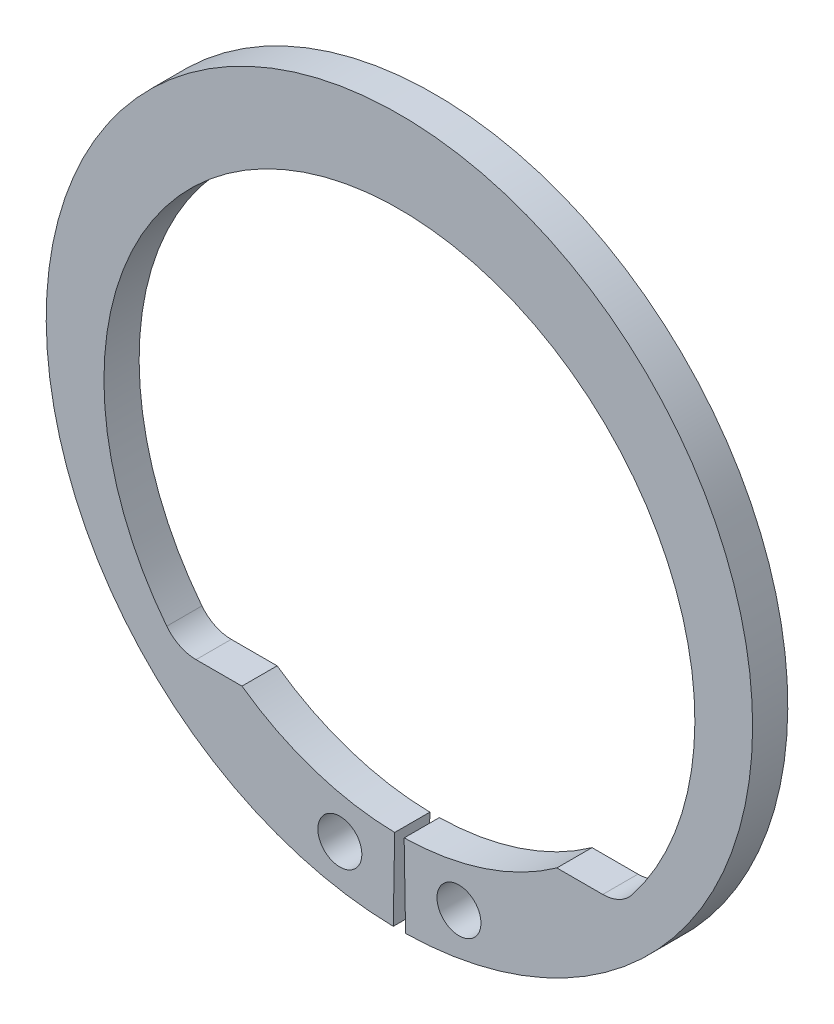
ISO-10303-21;
HEADER;
FILE_DESCRIPTION(('STEP AP214'),'2;1');
FILE_NAME('part.step','',(''),(''),'','','');
FILE_SCHEMA(('AUTOMOTIVE_DESIGN { 1 0 10303 214 1 1 1 1 }'));
ENDSEC;
DATA;
#1=APPLICATION_CONTEXT('core data for automotive mechanical design processes');
#2=APPLICATION_PROTOCOL_DEFINITION('international standard','automotive_design',2000,#1);
#3=PRODUCT_CONTEXT('',#1,'mechanical');
#4=PRODUCT('Part','Part','',(#3));
#5=PRODUCT_RELATED_PRODUCT_CATEGORY('part','',(#4));
#6=PRODUCT_DEFINITION_FORMATION('','',#4);
#7=PRODUCT_DEFINITION_CONTEXT('part definition',#1,'design');
#8=PRODUCT_DEFINITION('design','',#6,#7);
#9=PRODUCT_DEFINITION_SHAPE('','',#8);
#10=(LENGTH_UNIT() NAMED_UNIT(*) SI_UNIT(.MILLI.,.METRE.));
#11=(NAMED_UNIT(*) PLANE_ANGLE_UNIT() SI_UNIT($,.RADIAN.));
#12=(NAMED_UNIT(*) SI_UNIT($,.STERADIAN.) SOLID_ANGLE_UNIT());
#13=UNCERTAINTY_MEASURE_WITH_UNIT(LENGTH_MEASURE(1.E-05),#10,'distance_accuracy_value','');
#14=(GEOMETRIC_REPRESENTATION_CONTEXT(3) GLOBAL_UNCERTAINTY_ASSIGNED_CONTEXT((#13)) GLOBAL_UNIT_ASSIGNED_CONTEXT((#10,
#11,#12)) REPRESENTATION_CONTEXT('',''));
#15=CARTESIAN_POINT('',(0.,0.,0.));
#16=DIRECTION('',(0.,0.,1.));
#17=DIRECTION('',(1.,0.,0.));
#18=AXIS2_PLACEMENT_3D('',#15,#16,#17);
#19=CARTESIAN_POINT('',(0.,0.,0.6));
#20=DIRECTION('',(0.,0.,1.));
#21=DIRECTION('',(1.,0.,0.));
#22=AXIS2_PLACEMENT_3D('',#19,#20,#21);
#23=PLANE('',#22);
#24=CARTESIAN_POINT('',(0.,0.,0.6));
#25=DIRECTION('',(0.,0.,-1.));
#26=DIRECTION('',(1.,0.,0.));
#27=AXIS2_PLACEMENT_3D('',#24,#25,#26);
#28=CIRCLE('',#27,9.25);
#29=CARTESIAN_POINT('',(-0.161434759544872,-9.24859118019662,0.6));
#30=VERTEX_POINT('',#29);
#31=CARTESIAN_POINT('',(-5.37133596044777,-7.53068721963677,0.6));
#32=VERTEX_POINT('',#31);
#33=EDGE_CURVE('E170',#30,#32,#28,.T.);
#34=ORIENTED_EDGE('',*,*,#33,.T.);
#35=DIRECTION('',(-1.,0.,0.));
#36=VECTOR('',#35,1.);
#37=CARTESIAN_POINT('',(-5.37133596044777,-7.53068721963677,0.6));
#38=LINE('',#37,#36);
#39=CARTESIAN_POINT('',(-6.93737566496488,-7.53068721963677,0.6));
#40=VERTEX_POINT('',#39);
#41=EDGE_CURVE('E172',#32,#40,#38,.T.);
#42=ORIENTED_EDGE('',*,*,#41,.T.);
#43=CARTESIAN_POINT('',(-6.93737566496488,-6.26068721963677,0.6));
#44=DIRECTION('',(0.,0.,1.));
#45=DIRECTION('',(1.,0.,0.));
#46=AXIS2_PLACEMENT_3D('',#43,#44,#45);
#47=CIRCLE('',#46,1.27);
#48=CARTESIAN_POINT('',(-7.93741495449175,-7.04351633215278,0.6));
#49=VERTEX_POINT('',#48);
#50=EDGE_CURVE('E11',#40,#49,#47,.F.);
#51=ORIENTED_EDGE('',*,*,#50,.T.);
#52=CARTESIAN_POINT('',(0.,-0.830120949021631,0.6));
#53=DIRECTION('',(0.,0.,-1.));
#54=DIRECTION('',(-1.,0.,0.));
#55=AXIS2_PLACEMENT_3D('',#52,#53,#54);
#56=CIRCLE('',#55,10.0801209490216);
#57=CARTESIAN_POINT('',(7.93741495449175,-7.04351633215278,0.6));
#58=VERTEX_POINT('',#57);
#59=EDGE_CURVE('E175',#49,#58,#56,.T.);
#60=ORIENTED_EDGE('',*,*,#59,.T.);
#61=CARTESIAN_POINT('',(6.93737566496488,-6.26068721963677,0.6));
#62=DIRECTION('',(0.,0.,-1.));
#63=DIRECTION('',(-1.,0.,0.));
#64=AXIS2_PLACEMENT_3D('',#61,#62,#63);
#65=CIRCLE('',#64,1.27);
#66=CARTESIAN_POINT('',(6.93737566496488,-7.53068721963677,0.6));
#67=VERTEX_POINT('',#66);
#68=EDGE_CURVE('E133',#67,#58,#65,.F.);
#69=ORIENTED_EDGE('',*,*,#68,.F.);
#70=DIRECTION('',(1.,0.,0.));
#71=VECTOR('',#70,1.);
#72=CARTESIAN_POINT('',(5.37133596044777,-7.53068721963677,0.6));
#73=LINE('',#72,#71);
#74=CARTESIAN_POINT('',(5.37133596044777,-7.53068721963677,0.6));
#75=VERTEX_POINT('',#74);
#76=EDGE_CURVE('E115',#75,#67,#73,.T.);
#77=ORIENTED_EDGE('',*,*,#76,.F.);
#78=CARTESIAN_POINT('',(0.,0.,0.6));
#79=DIRECTION('',(0.,0.,1.));
#80=DIRECTION('',(-1.,0.,0.));
#81=AXIS2_PLACEMENT_3D('',#78,#79,#80);
#82=CIRCLE('',#81,9.25);
#83=CARTESIAN_POINT('',(0.161434759544872,-9.24859118019662,0.6));
#84=VERTEX_POINT('',#83);
#85=EDGE_CURVE('E131',#84,#75,#82,.T.);
#86=ORIENTED_EDGE('',*,*,#85,.F.);
#87=DIRECTION('',(-0.0174524064372834,0.999847695156391,0.));
#88=VECTOR('',#87,1.);
#89=CARTESIAN_POINT('',(0.161434759544872,-9.24859118019662,0.6));
#90=LINE('',#89,#88);
#91=CARTESIAN_POINT('',(0.210301497569266,-12.0481647266345,0.6));
#92=VERTEX_POINT('',#91);
#93=EDGE_CURVE('E134',#92,#84,#90,.T.);
#94=ORIENTED_EDGE('',*,*,#93,.F.);
#95=CARTESIAN_POINT('',(0.,0.,0.6));
#96=DIRECTION('',(0.,0.,1.));
#97=DIRECTION('',(1.,0.,0.));
#98=AXIS2_PLACEMENT_3D('',#95,#96,#97);
#99=CIRCLE('',#98,12.05);
#100=CARTESIAN_POINT('',(-0.210301497569266,-12.0481647266345,0.6));
#101=VERTEX_POINT('',#100);
#102=EDGE_CURVE('E177',#92,#101,#99,.T.);
#103=ORIENTED_EDGE('',*,*,#102,.T.);
#104=DIRECTION('',(0.0174524064372834,0.999847695156391,0.));
#105=VECTOR('',#104,1.);
#106=CARTESIAN_POINT('',(-0.161434759544872,-9.24859118019662,0.6));
#107=LINE('',#106,#105);
#108=EDGE_CURVE('E179',#101,#30,#107,.T.);
#109=ORIENTED_EDGE('',*,*,#108,.T.);
#110=EDGE_LOOP('',(#34,#42,#51,#60,#69,#77,#86,#94,#103,#109));
#111=FACE_BOUND('',#110,.T.);
#112=CARTESIAN_POINT('',(-2.03211580076021,-10.4543295037176,0.6));
#113=DIRECTION('',(0.,0.,1.));
#114=DIRECTION('',(1.,0.,0.));
#115=AXIS2_PLACEMENT_3D('',#112,#113,#114);
#116=CIRCLE('',#115,0.75);
#117=CARTESIAN_POINT('',(-1.2821158007602,-10.4543295037176,0.6));
#118=VERTEX_POINT('',#117);
#119=EDGE_CURVE('E164',#118,#118,#116,.T.);
#120=ORIENTED_EDGE('',*,*,#119,.F.);
#121=EDGE_LOOP('',(#120));
#122=FACE_BOUND('',#121,.T.);
#123=CARTESIAN_POINT('',(2.03211580076021,-10.4543295037176,0.6));
#124=DIRECTION('',(0.,0.,-1.));
#125=DIRECTION('',(-1.,0.,0.));
#126=AXIS2_PLACEMENT_3D('',#123,#124,#125);
#127=CIRCLE('',#126,0.75);
#128=CARTESIAN_POINT('',(1.2821158007602,-10.4543295037176,0.6));
#129=VERTEX_POINT('',#128);
#130=EDGE_CURVE('E150',#129,#129,#127,.T.);
#131=ORIENTED_EDGE('',*,*,#130,.T.);
#132=EDGE_LOOP('',(#131));
#133=FACE_BOUND('',#132,.T.);
#134=ADVANCED_FACE('F37',(#111,#122,#133),#23,.T.);
#135=CARTESIAN_POINT('',(0.,0.,-0.6));
#136=DIRECTION('',(0.,0.,1.));
#137=DIRECTION('',(1.,0.,0.));
#138=AXIS2_PLACEMENT_3D('',#135,#136,#137);
#139=PLANE('',#138);
#140=CARTESIAN_POINT('',(0.,0.,-0.6));
#141=DIRECTION('',(0.,0.,-1.));
#142=DIRECTION('',(1.,0.,0.));
#143=AXIS2_PLACEMENT_3D('',#140,#141,#142);
#144=CIRCLE('',#143,9.25);
#145=CARTESIAN_POINT('',(-0.161434759544872,-9.24859118019662,-0.6));
#146=VERTEX_POINT('',#145);
#147=CARTESIAN_POINT('',(-5.37133596044777,-7.53068721963677,-0.6));
#148=VERTEX_POINT('',#147);
#149=EDGE_CURVE('E167',#146,#148,#144,.T.);
#150=ORIENTED_EDGE('',*,*,#149,.F.);
#151=DIRECTION('',(0.0174524064372834,0.999847695156391,0.));
#152=VECTOR('',#151,1.);
#153=CARTESIAN_POINT('',(-0.161434759544872,-9.24859118019662,-0.6));
#154=LINE('',#153,#152);
#155=CARTESIAN_POINT('',(-0.210301497569266,-12.0481647266345,-0.6));
#156=VERTEX_POINT('',#155);
#157=EDGE_CURVE('E173',#156,#146,#154,.T.);
#158=ORIENTED_EDGE('',*,*,#157,.F.);
#159=CARTESIAN_POINT('',(0.,0.,-0.6));
#160=DIRECTION('',(0.,0.,1.));
#161=DIRECTION('',(1.,0.,0.));
#162=AXIS2_PLACEMENT_3D('',#159,#160,#161);
#163=CIRCLE('',#162,12.05);
#164=CARTESIAN_POINT('',(0.210301497569266,-12.0481647266345,-0.6));
#165=VERTEX_POINT('',#164);
#166=EDGE_CURVE('E188',#165,#156,#163,.T.);
#167=ORIENTED_EDGE('',*,*,#166,.F.);
#168=DIRECTION('',(-0.0174524064372834,0.999847695156391,0.));
#169=VECTOR('',#168,1.);
#170=CARTESIAN_POINT('',(0.161434759544872,-9.24859118019662,-0.6));
#171=LINE('',#170,#169);
#172=CARTESIAN_POINT('',(0.161434759544872,-9.24859118019662,-0.6));
#173=VERTEX_POINT('',#172);
#174=EDGE_CURVE('E139',#165,#173,#171,.T.);
#175=ORIENTED_EDGE('',*,*,#174,.T.);
#176=CARTESIAN_POINT('',(0.,0.,-0.6));
#177=DIRECTION('',(0.,0.,1.));
#178=DIRECTION('',(-1.,0.,0.));
#179=AXIS2_PLACEMENT_3D('',#176,#177,#178);
#180=CIRCLE('',#179,9.25);
#181=CARTESIAN_POINT('',(5.37133596044777,-7.53068721963677,-0.6));
#182=VERTEX_POINT('',#181);
#183=EDGE_CURVE('E148',#173,#182,#180,.T.);
#184=ORIENTED_EDGE('',*,*,#183,.T.);
#185=DIRECTION('',(1.,0.,0.));
#186=VECTOR('',#185,1.);
#187=CARTESIAN_POINT('',(5.37133596044777,-7.53068721963677,-0.6));
#188=LINE('',#187,#186);
#189=CARTESIAN_POINT('',(6.93737566496488,-7.53068721963677,-0.6));
#190=VERTEX_POINT('',#189);
#191=EDGE_CURVE('E118',#182,#190,#188,.T.);
#192=ORIENTED_EDGE('',*,*,#191,.T.);
#193=CARTESIAN_POINT('',(6.93737566496488,-6.26068721963677,-0.6));
#194=DIRECTION('',(0.,0.,-1.));
#195=DIRECTION('',(-1.,0.,0.));
#196=AXIS2_PLACEMENT_3D('',#193,#194,#195);
#197=CIRCLE('',#196,1.27);
#198=CARTESIAN_POINT('',(7.93741495449175,-7.04351633215278,-0.6));
#199=VERTEX_POINT('',#198);
#200=EDGE_CURVE('E159',#199,#190,#197,.T.);
#201=ORIENTED_EDGE('',*,*,#200,.F.);
#202=CARTESIAN_POINT('',(0.,-0.830120949021631,-0.6));
#203=DIRECTION('',(0.,0.,-1.));
#204=DIRECTION('',(-1.,0.,0.));
#205=AXIS2_PLACEMENT_3D('',#202,#203,#204);
#206=CIRCLE('',#205,10.0801209490216);
#207=CARTESIAN_POINT('',(-7.93741495449175,-7.04351633215278,-0.6));
#208=VERTEX_POINT('',#207);
#209=EDGE_CURVE('E186',#208,#199,#206,.T.);
#210=ORIENTED_EDGE('',*,*,#209,.F.);
#211=CARTESIAN_POINT('',(-6.93737566496488,-6.26068721963677,-0.6));
#212=DIRECTION('',(0.,0.,1.));
#213=DIRECTION('',(1.,0.,0.));
#214=AXIS2_PLACEMENT_3D('',#211,#212,#213);
#215=CIRCLE('',#214,1.27);
#216=CARTESIAN_POINT('',(-6.93737566496488,-7.53068721963677,-0.6));
#217=VERTEX_POINT('',#216);
#218=EDGE_CURVE('E45',#208,#217,#215,.T.);
#219=ORIENTED_EDGE('',*,*,#218,.T.);
#220=DIRECTION('',(-1.,0.,0.));
#221=VECTOR('',#220,1.);
#222=CARTESIAN_POINT('',(-5.37133596044777,-7.53068721963677,-0.6));
#223=LINE('',#222,#221);
#224=EDGE_CURVE('E184',#148,#217,#223,.T.);
#225=ORIENTED_EDGE('',*,*,#224,.F.);
#226=EDGE_LOOP('',(#150,#158,#167,#175,#184,#192,#201,#210,#219,#225));
#227=FACE_BOUND('',#226,.T.);
#228=CARTESIAN_POINT('',(-2.03211580076021,-10.4543295037176,-0.6));
#229=DIRECTION('',(0.,0.,1.));
#230=DIRECTION('',(1.,0.,0.));
#231=AXIS2_PLACEMENT_3D('',#228,#229,#230);
#232=CIRCLE('',#231,0.75);
#233=CARTESIAN_POINT('',(-1.2821158007602,-10.4543295037176,-0.6));
#234=VERTEX_POINT('',#233);
#235=EDGE_CURVE('E163',#234,#234,#232,.T.);
#236=ORIENTED_EDGE('',*,*,#235,.T.);
#237=EDGE_LOOP('',(#236));
#238=FACE_BOUND('',#237,.T.);
#239=CARTESIAN_POINT('',(2.03211580076021,-10.4543295037176,-0.6));
#240=DIRECTION('',(0.,0.,-1.));
#241=DIRECTION('',(-1.,0.,0.));
#242=AXIS2_PLACEMENT_3D('',#239,#240,#241);
#243=CIRCLE('',#242,0.75);
#244=CARTESIAN_POINT('',(1.2821158007602,-10.4543295037176,-0.6));
#245=VERTEX_POINT('',#244);
#246=EDGE_CURVE('E144',#245,#245,#243,.T.);
#247=ORIENTED_EDGE('',*,*,#246,.F.);
#248=EDGE_LOOP('',(#247));
#249=FACE_BOUND('',#248,.T.);
#250=ADVANCED_FACE('F211',(#227,#238,#249),#139,.F.);
#251=CARTESIAN_POINT('',(0.,0.,0.6));
#252=DIRECTION('',(0.,0.,-1.));
#253=DIRECTION('',(-1.,0.,0.));
#254=AXIS2_PLACEMENT_3D('',#251,#252,#253);
#255=CYLINDRICAL_SURFACE('',#254,9.25);
#256=ORIENTED_EDGE('',*,*,#149,.T.);
#257=DIRECTION('',(0.,0.,-1.));
#258=VECTOR('',#257,1.);
#259=CARTESIAN_POINT('',(-5.37133596044777,-7.53068721963677,0.6));
#260=LINE('',#259,#258);
#261=EDGE_CURVE('E196',#32,#148,#260,.T.);
#262=ORIENTED_EDGE('',*,*,#261,.F.);
#263=ORIENTED_EDGE('',*,*,#33,.F.);
#264=DIRECTION('',(0.,0.,-1.));
#265=VECTOR('',#264,1.);
#266=CARTESIAN_POINT('',(-0.161434759544872,-9.24859118019662,0.6));
#267=LINE('',#266,#265);
#268=EDGE_CURVE('E181',#30,#146,#267,.T.);
#269=ORIENTED_EDGE('',*,*,#268,.T.);
#270=EDGE_LOOP('',(#256,#262,#263,#269));
#271=FACE_BOUND('',#270,.T.);
#272=ADVANCED_FACE('F232',(#271),#255,.F.);
#273=CARTESIAN_POINT('',(-5.37133596044777,-7.53068721963677,0.6));
#274=DIRECTION('',(0.,-1.,0.));
#275=DIRECTION('',(0.,0.,-1.));
#276=AXIS2_PLACEMENT_3D('',#273,#274,#275);
#277=PLANE('',#276);
#278=ORIENTED_EDGE('',*,*,#224,.T.);
#279=DIRECTION('',(0.,0.,1.));
#280=VECTOR('',#279,1.);
#281=CARTESIAN_POINT('',(-6.93737566496488,-7.53068721963677,0.6));
#282=LINE('',#281,#280);
#283=EDGE_CURVE('E52',#217,#40,#282,.T.);
#284=ORIENTED_EDGE('',*,*,#283,.T.);
#285=ORIENTED_EDGE('',*,*,#41,.F.);
#286=ORIENTED_EDGE('',*,*,#261,.T.);
#287=EDGE_LOOP('',(#278,#284,#285,#286));
#288=FACE_BOUND('',#287,.T.);
#289=ADVANCED_FACE('F246',(#288),#277,.F.);
#290=CARTESIAN_POINT('',(0.,-0.830120949021631,0.6));
#291=DIRECTION('',(0.,0.,-1.));
#292=DIRECTION('',(-1.,0.,0.));
#293=AXIS2_PLACEMENT_3D('',#290,#291,#292);
#294=CYLINDRICAL_SURFACE('',#293,10.0801209490216);
#295=ORIENTED_EDGE('',*,*,#59,.F.);
#296=DIRECTION('',(0.,0.,-1.));
#297=VECTOR('',#296,1.);
#298=CARTESIAN_POINT('',(-7.93741495449175,-7.04351633215278,0.6));
#299=LINE('',#298,#297);
#300=EDGE_CURVE('E199',#49,#208,#299,.T.);
#301=ORIENTED_EDGE('',*,*,#300,.T.);
#302=ORIENTED_EDGE('',*,*,#209,.T.);
#303=DIRECTION('',(0.,0.,-1.));
#304=VECTOR('',#303,1.);
#305=CARTESIAN_POINT('',(7.93741495449175,-7.04351633215278,0.6));
#306=LINE('',#305,#304);
#307=EDGE_CURVE('E123',#58,#199,#306,.T.);
#308=ORIENTED_EDGE('',*,*,#307,.F.);
#309=EDGE_LOOP('',(#295,#301,#302,#308));
#310=FACE_BOUND('',#309,.T.);
#311=ADVANCED_FACE('F205',(#310),#294,.F.);
#312=CARTESIAN_POINT('',(0.,0.,0.6));
#313=DIRECTION('',(0.,0.,-1.));
#314=DIRECTION('',(-1.,0.,0.));
#315=AXIS2_PLACEMENT_3D('',#312,#313,#314);
#316=CYLINDRICAL_SURFACE('',#315,12.05);
#317=ORIENTED_EDGE('',*,*,#166,.T.);
#318=DIRECTION('',(0.,0.,-1.));
#319=VECTOR('',#318,1.);
#320=CARTESIAN_POINT('',(-0.210301497569266,-12.0481647266345,0.6));
#321=LINE('',#320,#319);
#322=EDGE_CURVE('E193',#101,#156,#321,.T.);
#323=ORIENTED_EDGE('',*,*,#322,.F.);
#324=ORIENTED_EDGE('',*,*,#102,.F.);
#325=DIRECTION('',(0.,0.,-1.));
#326=VECTOR('',#325,1.);
#327=CARTESIAN_POINT('',(0.210301497569266,-12.0481647266345,0.6));
#328=LINE('',#327,#326);
#329=EDGE_CURVE('E124',#92,#165,#328,.T.);
#330=ORIENTED_EDGE('',*,*,#329,.T.);
#331=EDGE_LOOP('',(#317,#323,#324,#330));
#332=FACE_BOUND('',#331,.T.);
#333=ADVANCED_FACE('F239',(#332),#316,.T.);
#334=CARTESIAN_POINT('',(-0.161434759544872,-9.24859118019662,0.6));
#335=DIRECTION('',(-0.999847695156391,0.0174524064372834,0.));
#336=DIRECTION('',(-0.0174524064372834,-0.999847695156391,0.));
#337=AXIS2_PLACEMENT_3D('',#334,#335,#336);
#338=PLANE('',#337);
#339=ORIENTED_EDGE('',*,*,#157,.T.);
#340=ORIENTED_EDGE('',*,*,#268,.F.);
#341=ORIENTED_EDGE('',*,*,#108,.F.);
#342=ORIENTED_EDGE('',*,*,#322,.T.);
#343=EDGE_LOOP('',(#339,#340,#341,#342));
#344=FACE_BOUND('',#343,.T.);
#345=ADVANCED_FACE('F236',(#344),#338,.F.);
#346=CARTESIAN_POINT('',(-2.03211580076021,-10.4543295037176,0.6));
#347=DIRECTION('',(0.,0.,-1.));
#348=DIRECTION('',(-1.,0.,0.));
#349=AXIS2_PLACEMENT_3D('',#346,#347,#348);
#350=CYLINDRICAL_SURFACE('',#349,0.75);
#351=ORIENTED_EDGE('',*,*,#119,.T.);
#352=EDGE_LOOP('',(#351));
#353=FACE_BOUND('',#352,.T.);
#354=ORIENTED_EDGE('',*,*,#235,.F.);
#355=EDGE_LOOP('',(#354));
#356=FACE_BOUND('',#355,.T.);
#357=ADVANCED_FACE('F234',(#353,#356),#350,.F.);
#358=CARTESIAN_POINT('',(-6.93737566496488,-6.26068721963677,0.6));
#359=DIRECTION('',(0.,0.,-1.));
#360=DIRECTION('',(-1.,0.,0.));
#361=AXIS2_PLACEMENT_3D('',#358,#359,#360);
#362=CYLINDRICAL_SURFACE('',#361,1.27);
#363=ORIENTED_EDGE('',*,*,#50,.F.);
#364=ORIENTED_EDGE('',*,*,#283,.F.);
#365=ORIENTED_EDGE('',*,*,#218,.F.);
#366=ORIENTED_EDGE('',*,*,#300,.F.);
#367=EDGE_LOOP('',(#363,#364,#365,#366));
#368=FACE_BOUND('',#367,.T.);
#369=ADVANCED_FACE('F39',(#368),#362,.F.);
#370=CARTESIAN_POINT('',(0.,0.,0.6));
#371=DIRECTION('',(0.,0.,-1.));
#372=DIRECTION('',(1.,0.,0.));
#373=AXIS2_PLACEMENT_3D('',#370,#371,#372);
#374=CYLINDRICAL_SURFACE('',#373,9.25);
#375=ORIENTED_EDGE('',*,*,#183,.F.);
#376=DIRECTION('',(0.,0.,-1.));
#377=VECTOR('',#376,1.);
#378=CARTESIAN_POINT('',(0.161434759544872,-9.24859118019662,0.6));
#379=LINE('',#378,#377);
#380=EDGE_CURVE('E137',#84,#173,#379,.T.);
#381=ORIENTED_EDGE('',*,*,#380,.F.);
#382=ORIENTED_EDGE('',*,*,#85,.T.);
#383=DIRECTION('',(0.,0.,-1.));
#384=VECTOR('',#383,1.);
#385=CARTESIAN_POINT('',(5.37133596044777,-7.53068721963677,0.6));
#386=LINE('',#385,#384);
#387=EDGE_CURVE('E112',#75,#182,#386,.T.);
#388=ORIENTED_EDGE('',*,*,#387,.T.);
#389=EDGE_LOOP('',(#375,#381,#382,#388));
#390=FACE_BOUND('',#389,.T.);
#391=ADVANCED_FACE('F136',(#390),#374,.F.);
#392=CARTESIAN_POINT('',(5.37133596044777,-7.53068721963677,0.6));
#393=DIRECTION('',(0.,-1.,0.));
#394=DIRECTION('',(0.,0.,-1.));
#395=AXIS2_PLACEMENT_3D('',#392,#393,#394);
#396=PLANE('',#395);
#397=ORIENTED_EDGE('',*,*,#191,.F.);
#398=ORIENTED_EDGE('',*,*,#387,.F.);
#399=ORIENTED_EDGE('',*,*,#76,.T.);
#400=DIRECTION('',(0.,0.,1.));
#401=VECTOR('',#400,1.);
#402=CARTESIAN_POINT('',(6.93737566496488,-7.53068721963677,0.6));
#403=LINE('',#402,#401);
#404=EDGE_CURVE('E157',#190,#67,#403,.T.);
#405=ORIENTED_EDGE('',*,*,#404,.F.);
#406=EDGE_LOOP('',(#397,#398,#399,#405));
#407=FACE_BOUND('',#406,.T.);
#408=ADVANCED_FACE('F114',(#407),#396,.F.);
#409=CARTESIAN_POINT('',(0.161434759544872,-9.24859118019662,0.6));
#410=DIRECTION('',(0.999847695156391,0.0174524064372834,0.));
#411=DIRECTION('',(0.0174524064372834,-0.999847695156391,0.));
#412=AXIS2_PLACEMENT_3D('',#409,#410,#411);
#413=PLANE('',#412);
#414=ORIENTED_EDGE('',*,*,#174,.F.);
#415=ORIENTED_EDGE('',*,*,#329,.F.);
#416=ORIENTED_EDGE('',*,*,#93,.T.);
#417=ORIENTED_EDGE('',*,*,#380,.T.);
#418=EDGE_LOOP('',(#414,#415,#416,#417));
#419=FACE_BOUND('',#418,.T.);
#420=ADVANCED_FACE('F221',(#419),#413,.F.);
#421=CARTESIAN_POINT('',(2.03211580076021,-10.4543295037176,0.6));
#422=DIRECTION('',(0.,0.,-1.));
#423=DIRECTION('',(1.,0.,0.));
#424=AXIS2_PLACEMENT_3D('',#421,#422,#423);
#425=CYLINDRICAL_SURFACE('',#424,0.75);
#426=ORIENTED_EDGE('',*,*,#130,.F.);
#427=EDGE_LOOP('',(#426));
#428=FACE_BOUND('',#427,.T.);
#429=ORIENTED_EDGE('',*,*,#246,.T.);
#430=EDGE_LOOP('',(#429));
#431=FACE_BOUND('',#430,.T.);
#432=ADVANCED_FACE('F216',(#428,#431),#425,.F.);
#433=CARTESIAN_POINT('',(6.93737566496488,-6.26068721963677,0.6));
#434=DIRECTION('',(0.,0.,-1.));
#435=DIRECTION('',(1.,0.,0.));
#436=AXIS2_PLACEMENT_3D('',#433,#434,#435);
#437=CYLINDRICAL_SURFACE('',#436,1.27);
#438=ORIENTED_EDGE('',*,*,#68,.T.);
#439=ORIENTED_EDGE('',*,*,#307,.T.);
#440=ORIENTED_EDGE('',*,*,#200,.T.);
#441=ORIENTED_EDGE('',*,*,#404,.T.);
#442=EDGE_LOOP('',(#438,#439,#440,#441));
#443=FACE_BOUND('',#442,.T.);
#444=ADVANCED_FACE('F214',(#443),#437,.F.);
#445=CLOSED_SHELL('',(#134,#250,#272,#289,#311,#333,#345,#357,#369,#391,#408,#420,#432,#444));
#446=MANIFOLD_SOLID_BREP('B2',#445);
#447=ADVANCED_BREP_SHAPE_REPRESENTATION('',(#18,#446),#14);
#448=SHAPE_DEFINITION_REPRESENTATION(#9,#447);
ENDSEC;
END-ISO-10303-21;
